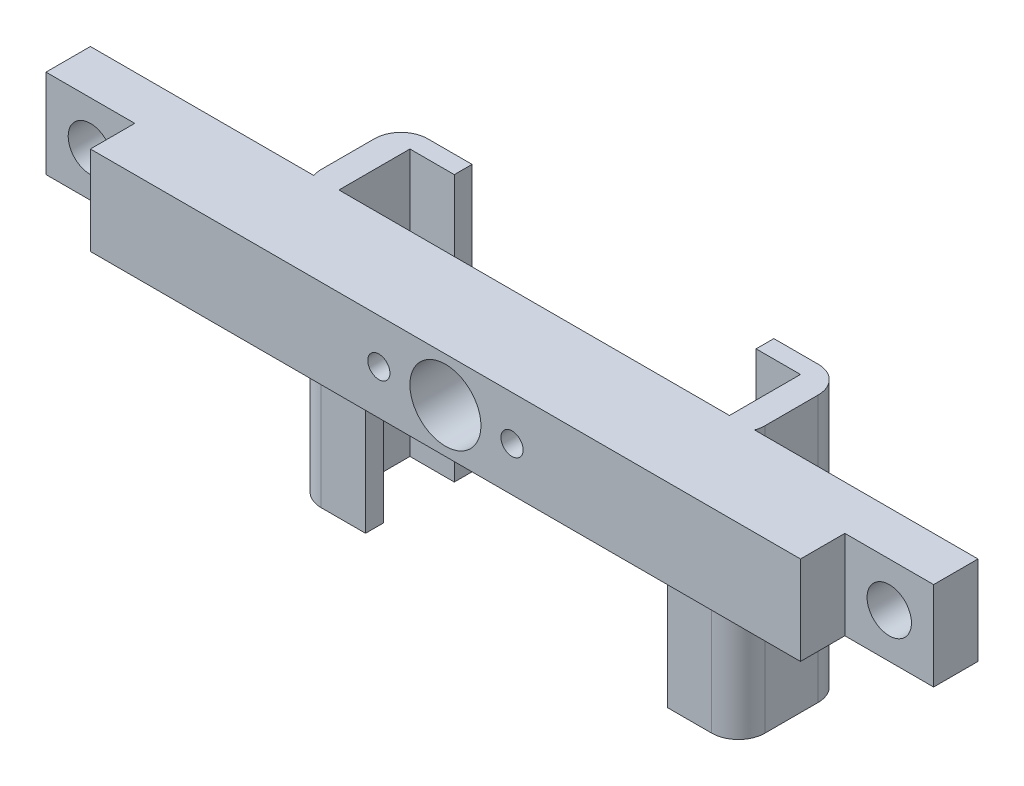
ISO-10303-21;
HEADER;
FILE_DESCRIPTION(('STEP AP214'),'2;1');
FILE_NAME('part.step','',(''),(''),'','','');
FILE_SCHEMA(('AUTOMOTIVE_DESIGN { 1 0 10303 214 1 1 1 1 }'));
ENDSEC;
DATA;
#1=APPLICATION_CONTEXT('core data for automotive mechanical design processes');
#2=APPLICATION_PROTOCOL_DEFINITION('international standard','automotive_design',2000,#1);
#3=PRODUCT_CONTEXT('',#1,'mechanical');
#4=PRODUCT('Part','Part','',(#3));
#5=PRODUCT_RELATED_PRODUCT_CATEGORY('part','',(#4));
#6=PRODUCT_DEFINITION_FORMATION('','',#4);
#7=PRODUCT_DEFINITION_CONTEXT('part definition',#1,'design');
#8=PRODUCT_DEFINITION('design','',#6,#7);
#9=PRODUCT_DEFINITION_SHAPE('','',#8);
#10=(LENGTH_UNIT() NAMED_UNIT(*) SI_UNIT(.MILLI.,.METRE.));
#11=(NAMED_UNIT(*) PLANE_ANGLE_UNIT() SI_UNIT($,.RADIAN.));
#12=(NAMED_UNIT(*) SI_UNIT($,.STERADIAN.) SOLID_ANGLE_UNIT());
#13=UNCERTAINTY_MEASURE_WITH_UNIT(LENGTH_MEASURE(1.E-05),#10,'distance_accuracy_value','');
#14=(GEOMETRIC_REPRESENTATION_CONTEXT(3) GLOBAL_UNCERTAINTY_ASSIGNED_CONTEXT((#13)) GLOBAL_UNIT_ASSIGNED_CONTEXT((#10,
#11,#12)) REPRESENTATION_CONTEXT('',''));
#15=CARTESIAN_POINT('',(0.,0.,0.));
#16=DIRECTION('',(0.,0.,1.));
#17=DIRECTION('',(1.,0.,0.));
#18=AXIS2_PLACEMENT_3D('',#15,#16,#17);
#19=CARTESIAN_POINT('',(-50.,-5.,10.));
#20=DIRECTION('',(0.,1.,0.));
#21=DIRECTION('',(0.,0.,1.));
#22=AXIS2_PLACEMENT_3D('',#19,#20,#21);
#23=PLANE('',#22);
#24=DIRECTION('',(0.,0.,-1.));
#25=VECTOR('',#24,1.);
#26=CARTESIAN_POINT('',(40.,-5.,10.));
#27=LINE('',#26,#25);
#28=CARTESIAN_POINT('',(40.,-5.,10.));
#29=VERTEX_POINT('',#28);
#30=CARTESIAN_POINT('',(40.,-5.,5.));
#31=VERTEX_POINT('',#30);
#32=EDGE_CURVE('E249',#29,#31,#27,.T.);
#33=ORIENTED_EDGE('',*,*,#32,.F.);
#34=DIRECTION('',(1.,0.,0.));
#35=VECTOR('',#34,1.);
#36=CARTESIAN_POINT('',(-50.,-5.,10.));
#37=LINE('',#36,#35);
#38=CARTESIAN_POINT('',(-40.,-5.,10.));
#39=VERTEX_POINT('',#38);
#40=EDGE_CURVE('E262',#39,#29,#37,.T.);
#41=ORIENTED_EDGE('',*,*,#40,.F.);
#42=DIRECTION('',(0.,0.,-1.));
#43=VECTOR('',#42,1.);
#44=CARTESIAN_POINT('',(-40.,-5.,10.));
#45=LINE('',#44,#43);
#46=CARTESIAN_POINT('',(-40.,-5.,5.));
#47=VERTEX_POINT('',#46);
#48=EDGE_CURVE('E554',#39,#47,#45,.T.);
#49=ORIENTED_EDGE('',*,*,#48,.T.);
#50=DIRECTION('',(-1.,0.,0.));
#51=VECTOR('',#50,1.);
#52=CARTESIAN_POINT('',(-50.,-5.,5.));
#53=LINE('',#52,#51);
#54=CARTESIAN_POINT('',(-50.,-5.,5.));
#55=VERTEX_POINT('',#54);
#56=EDGE_CURVE('E545',#47,#55,#53,.T.);
#57=ORIENTED_EDGE('',*,*,#56,.T.);
#58=DIRECTION('',(0.,0.,-1.));
#59=VECTOR('',#58,1.);
#60=CARTESIAN_POINT('',(-50.,-5.,10.));
#61=LINE('',#60,#59);
#62=CARTESIAN_POINT('',(-50.,-5.,0.));
#63=VERTEX_POINT('',#62);
#64=EDGE_CURVE('E261',#55,#63,#61,.T.);
#65=ORIENTED_EDGE('',*,*,#64,.T.);
#66=DIRECTION('',(1.,0.,0.));
#67=VECTOR('',#66,1.);
#68=CARTESIAN_POINT('',(-50.,-5.,0.));
#69=LINE('',#68,#67);
#70=CARTESIAN_POINT('',(-24.8284271247462,-5.,0.));
#71=VERTEX_POINT('',#70);
#72=EDGE_CURVE('E63',#63,#71,#69,.T.);
#73=ORIENTED_EDGE('',*,*,#72,.T.);
#74=CARTESIAN_POINT('',(-22.,-5.,-0.999999999999999));
#75=DIRECTION('',(0.,1.,0.));
#76=DIRECTION('',(0.,0.,1.));
#77=AXIS2_PLACEMENT_3D('',#74,#75,#76);
#78=CIRCLE('',#77,3.);
#79=CARTESIAN_POINT('',(-22.,-5.,2.));
#80=VERTEX_POINT('',#79);
#81=EDGE_CURVE('E335',#71,#80,#78,.T.);
#82=ORIENTED_EDGE('',*,*,#81,.T.);
#83=DIRECTION('',(-1.,0.,0.));
#84=VECTOR('',#83,1.);
#85=CARTESIAN_POINT('',(0.,-5.,2.));
#86=LINE('',#85,#84);
#87=CARTESIAN_POINT('',(-17.,-5.,2.));
#88=VERTEX_POINT('',#87);
#89=EDGE_CURVE('E502',#88,#80,#86,.T.);
#90=ORIENTED_EDGE('',*,*,#89,.F.);
#91=DIRECTION('',(0.,0.,1.));
#92=VECTOR('',#91,1.);
#93=CARTESIAN_POINT('',(-17.,-5.,0.));
#94=LINE('',#93,#92);
#95=CARTESIAN_POINT('',(-17.,-5.,0.));
#96=VERTEX_POINT('',#95);
#97=EDGE_CURVE('E507',#96,#88,#94,.T.);
#98=ORIENTED_EDGE('',*,*,#97,.F.);
#99=CARTESIAN_POINT('',(17.,-5.,0.));
#100=VERTEX_POINT('',#99);
#101=EDGE_CURVE('E376',#96,#100,#69,.T.);
#102=ORIENTED_EDGE('',*,*,#101,.T.);
#103=DIRECTION('',(0.,0.,1.));
#104=VECTOR('',#103,1.);
#105=CARTESIAN_POINT('',(17.,-5.,0.));
#106=LINE('',#105,#104);
#107=CARTESIAN_POINT('',(17.,-5.,2.));
#108=VERTEX_POINT('',#107);
#109=EDGE_CURVE('E425',#100,#108,#106,.T.);
#110=ORIENTED_EDGE('',*,*,#109,.T.);
#111=DIRECTION('',(1.,0.,0.));
#112=VECTOR('',#111,1.);
#113=CARTESIAN_POINT('',(0.,-5.,2.));
#114=LINE('',#113,#112);
#115=CARTESIAN_POINT('',(22.,-5.,2.));
#116=VERTEX_POINT('',#115);
#117=EDGE_CURVE('E343',#108,#116,#114,.T.);
#118=ORIENTED_EDGE('',*,*,#117,.T.);
#119=CARTESIAN_POINT('',(22.,-5.,-1.));
#120=DIRECTION('',(0.,1.,0.));
#121=DIRECTION('',(0.,0.,1.));
#122=AXIS2_PLACEMENT_3D('',#119,#120,#121);
#123=CIRCLE('',#122,3.);
#124=CARTESIAN_POINT('',(24.8284271247462,-5.,0.));
#125=VERTEX_POINT('',#124);
#126=EDGE_CURVE('E49',#116,#125,#123,.T.);
#127=ORIENTED_EDGE('',*,*,#126,.T.);
#128=CARTESIAN_POINT('',(50.,-5.,0.));
#129=VERTEX_POINT('',#128);
#130=EDGE_CURVE('E55',#125,#129,#69,.T.);
#131=ORIENTED_EDGE('',*,*,#130,.T.);
#132=DIRECTION('',(0.,0.,-1.));
#133=VECTOR('',#132,1.);
#134=CARTESIAN_POINT('',(50.,-5.,10.));
#135=LINE('',#134,#133);
#136=CARTESIAN_POINT('',(50.,-5.,5.));
#137=VERTEX_POINT('',#136);
#138=EDGE_CURVE('E256',#137,#129,#135,.T.);
#139=ORIENTED_EDGE('',*,*,#138,.F.);
#140=DIRECTION('',(1.,0.,0.));
#141=VECTOR('',#140,1.);
#142=CARTESIAN_POINT('',(50.,-5.,5.));
#143=LINE('',#142,#141);
#144=EDGE_CURVE('E239',#31,#137,#143,.T.);
#145=ORIENTED_EDGE('',*,*,#144,.F.);
#146=EDGE_LOOP('',(#33,#41,#49,#57,#65,#73,#82,#90,#98,#102,#110,#118,#127,#131,#139,#145));
#147=FACE_BOUND('',#146,.T.);
#148=ADVANCED_FACE('F40',(#147),#23,.F.);
#149=CARTESIAN_POINT('',(50.,5.,10.));
#150=DIRECTION('',(-1.,0.,0.));
#151=DIRECTION('',(0.,0.,1.));
#152=AXIS2_PLACEMENT_3D('',#149,#150,#151);
#153=PLANE('',#152);
#154=DIRECTION('',(0.,1.,0.));
#155=VECTOR('',#154,1.);
#156=CARTESIAN_POINT('',(50.,-5.,5.));
#157=LINE('',#156,#155);
#158=CARTESIAN_POINT('',(50.,5.,5.));
#159=VERTEX_POINT('',#158);
#160=EDGE_CURVE('E243',#137,#159,#157,.T.);
#161=ORIENTED_EDGE('',*,*,#160,.F.);
#162=ORIENTED_EDGE('',*,*,#138,.T.);
#163=DIRECTION('',(0.,1.,0.));
#164=VECTOR('',#163,1.);
#165=CARTESIAN_POINT('',(50.,5.,0.));
#166=LINE('',#165,#164);
#167=CARTESIAN_POINT('',(50.,5.,0.));
#168=VERTEX_POINT('',#167);
#169=EDGE_CURVE('E352',#129,#168,#166,.T.);
#170=ORIENTED_EDGE('',*,*,#169,.T.);
#171=DIRECTION('',(0.,0.,-1.));
#172=VECTOR('',#171,1.);
#173=CARTESIAN_POINT('',(50.,5.,10.));
#174=LINE('',#173,#172);
#175=EDGE_CURVE('E257',#159,#168,#174,.T.);
#176=ORIENTED_EDGE('',*,*,#175,.F.);
#177=EDGE_LOOP('',(#161,#162,#170,#176));
#178=FACE_BOUND('',#177,.T.);
#179=ADVANCED_FACE('F254',(#178),#153,.F.);
#180=CARTESIAN_POINT('',(-50.,5.,10.));
#181=DIRECTION('',(0.,-1.,0.));
#182=DIRECTION('',(0.,0.,-1.));
#183=AXIS2_PLACEMENT_3D('',#180,#181,#182);
#184=PLANE('',#183);
#185=CARTESIAN_POINT('',(-22.,5.,-0.999999999999999));
#186=DIRECTION('',(0.,-1.,0.));
#187=DIRECTION('',(0.,0.,-1.));
#188=AXIS2_PLACEMENT_3D('',#185,#186,#187);
#189=CIRCLE('',#188,3.);
#190=CARTESIAN_POINT('',(-25.,5.,-0.999999999999999));
#191=VERTEX_POINT('',#190);
#192=CARTESIAN_POINT('',(-24.8284271247462,5.,0.));
#193=VERTEX_POINT('',#192);
#194=EDGE_CURVE('E312',#191,#193,#189,.F.);
#195=ORIENTED_EDGE('',*,*,#194,.T.);
#196=DIRECTION('',(-1.,0.,0.));
#197=VECTOR('',#196,1.);
#198=CARTESIAN_POINT('',(-50.,5.,0.));
#199=LINE('',#198,#197);
#200=CARTESIAN_POINT('',(-50.,5.,0.));
#201=VERTEX_POINT('',#200);
#202=EDGE_CURVE('E358',#193,#201,#199,.T.);
#203=ORIENTED_EDGE('',*,*,#202,.T.);
#204=DIRECTION('',(0.,0.,-1.));
#205=VECTOR('',#204,1.);
#206=CARTESIAN_POINT('',(-50.,5.,10.));
#207=LINE('',#206,#205);
#208=CARTESIAN_POINT('',(-50.,5.,5.));
#209=VERTEX_POINT('',#208);
#210=EDGE_CURVE('E267',#209,#201,#207,.T.);
#211=ORIENTED_EDGE('',*,*,#210,.F.);
#212=DIRECTION('',(-1.,0.,0.));
#213=VECTOR('',#212,1.);
#214=CARTESIAN_POINT('',(-50.,5.,5.));
#215=LINE('',#214,#213);
#216=CARTESIAN_POINT('',(-40.,5.,5.));
#217=VERTEX_POINT('',#216);
#218=EDGE_CURVE('E551',#217,#209,#215,.T.);
#219=ORIENTED_EDGE('',*,*,#218,.F.);
#220=DIRECTION('',(0.,0.,-1.));
#221=VECTOR('',#220,1.);
#222=CARTESIAN_POINT('',(-40.,5.,10.));
#223=LINE('',#222,#221);
#224=CARTESIAN_POINT('',(-40.,5.,10.));
#225=VERTEX_POINT('',#224);
#226=EDGE_CURVE('E555',#225,#217,#223,.T.);
#227=ORIENTED_EDGE('',*,*,#226,.F.);
#228=DIRECTION('',(-1.,0.,0.));
#229=VECTOR('',#228,1.);
#230=CARTESIAN_POINT('',(-50.,5.,10.));
#231=LINE('',#230,#229);
#232=CARTESIAN_POINT('',(40.,5.,10.));
#233=VERTEX_POINT('',#232);
#234=EDGE_CURVE('E270',#233,#225,#231,.T.);
#235=ORIENTED_EDGE('',*,*,#234,.F.);
#236=DIRECTION('',(0.,0.,-1.));
#237=VECTOR('',#236,1.);
#238=CARTESIAN_POINT('',(40.,5.,10.));
#239=LINE('',#238,#237);
#240=CARTESIAN_POINT('',(40.,5.,5.));
#241=VERTEX_POINT('',#240);
#242=EDGE_CURVE('E250',#233,#241,#239,.T.);
#243=ORIENTED_EDGE('',*,*,#242,.T.);
#244=DIRECTION('',(1.,0.,0.));
#245=VECTOR('',#244,1.);
#246=CARTESIAN_POINT('',(50.,5.,5.));
#247=LINE('',#246,#245);
#248=EDGE_CURVE('E573',#241,#159,#247,.T.);
#249=ORIENTED_EDGE('',*,*,#248,.T.);
#250=ORIENTED_EDGE('',*,*,#175,.T.);
#251=CARTESIAN_POINT('',(24.8284271247462,5.,0.));
#252=VERTEX_POINT('',#251);
#253=EDGE_CURVE('E351',#168,#252,#199,.T.);
#254=ORIENTED_EDGE('',*,*,#253,.T.);
#255=CARTESIAN_POINT('',(22.,5.,-1.));
#256=DIRECTION('',(0.,-1.,0.));
#257=DIRECTION('',(0.,0.,-1.));
#258=AXIS2_PLACEMENT_3D('',#255,#256,#257);
#259=CIRCLE('',#258,3.);
#260=CARTESIAN_POINT('',(25.,5.,-0.999999999999999));
#261=VERTEX_POINT('',#260);
#262=EDGE_CURVE('E309',#252,#261,#259,.F.);
#263=ORIENTED_EDGE('',*,*,#262,.T.);
#264=DIRECTION('',(0.,0.,1.));
#265=VECTOR('',#264,1.);
#266=CARTESIAN_POINT('',(25.,5.,-10.));
#267=LINE('',#266,#265);
#268=CARTESIAN_POINT('',(25.,5.,-7.));
#269=VERTEX_POINT('',#268);
#270=EDGE_CURVE('E366',#269,#261,#267,.T.);
#271=ORIENTED_EDGE('',*,*,#270,.F.);
#272=CARTESIAN_POINT('',(22.,5.,-7.));
#273=DIRECTION('',(0.,-1.,0.));
#274=DIRECTION('',(0.,0.,-1.));
#275=AXIS2_PLACEMENT_3D('',#272,#273,#274);
#276=CIRCLE('',#275,3.);
#277=CARTESIAN_POINT('',(22.,5.,-10.));
#278=VERTEX_POINT('',#277);
#279=EDGE_CURVE('E292',#269,#278,#276,.F.);
#280=ORIENTED_EDGE('',*,*,#279,.T.);
#281=DIRECTION('',(1.,0.,0.));
#282=VECTOR('',#281,1.);
#283=CARTESIAN_POINT('',(0.,5.,-10.));
#284=LINE('',#283,#282);
#285=CARTESIAN_POINT('',(17.,5.,-10.));
#286=VERTEX_POINT('',#285);
#287=EDGE_CURVE('E392',#286,#278,#284,.T.);
#288=ORIENTED_EDGE('',*,*,#287,.F.);
#289=DIRECTION('',(0.,0.,-1.));
#290=VECTOR('',#289,1.);
#291=CARTESIAN_POINT('',(17.,5.,-10.));
#292=LINE('',#291,#290);
#293=CARTESIAN_POINT('',(17.,5.,-8.));
#294=VERTEX_POINT('',#293);
#295=EDGE_CURVE('E403',#294,#286,#292,.T.);
#296=ORIENTED_EDGE('',*,*,#295,.F.);
#297=DIRECTION('',(1.,0.,0.));
#298=VECTOR('',#297,1.);
#299=CARTESIAN_POINT('',(17.,5.,-8.));
#300=LINE('',#299,#298);
#301=CARTESIAN_POINT('',(22.,5.,-8.));
#302=VERTEX_POINT('',#301);
#303=EDGE_CURVE('E396',#294,#302,#300,.T.);
#304=ORIENTED_EDGE('',*,*,#303,.T.);
#305=DIRECTION('',(0.,0.,1.));
#306=VECTOR('',#305,1.);
#307=CARTESIAN_POINT('',(22.,5.,-10.));
#308=LINE('',#307,#306);
#309=CARTESIAN_POINT('',(22.,5.,0.));
#310=VERTEX_POINT('',#309);
#311=EDGE_CURVE('E360',#302,#310,#308,.T.);
#312=ORIENTED_EDGE('',*,*,#311,.T.);
#313=CARTESIAN_POINT('',(-22.,5.,0.));
#314=VERTEX_POINT('',#313);
#315=EDGE_CURVE('E356',#310,#314,#199,.T.);
#316=ORIENTED_EDGE('',*,*,#315,.T.);
#317=DIRECTION('',(0.,0.,1.));
#318=VECTOR('',#317,1.);
#319=CARTESIAN_POINT('',(-22.,5.,-10.));
#320=LINE('',#319,#318);
#321=CARTESIAN_POINT('',(-22.,5.,-8.));
#322=VERTEX_POINT('',#321);
#323=EDGE_CURVE('E465',#322,#314,#320,.T.);
#324=ORIENTED_EDGE('',*,*,#323,.F.);
#325=DIRECTION('',(-1.,0.,0.));
#326=VECTOR('',#325,1.);
#327=CARTESIAN_POINT('',(-17.,5.,-8.));
#328=LINE('',#327,#326);
#329=CARTESIAN_POINT('',(-17.,5.,-8.));
#330=VERTEX_POINT('',#329);
#331=EDGE_CURVE('E472',#330,#322,#328,.T.);
#332=ORIENTED_EDGE('',*,*,#331,.F.);
#333=DIRECTION('',(0.,0.,-1.));
#334=VECTOR('',#333,1.);
#335=CARTESIAN_POINT('',(-17.,5.,-10.));
#336=LINE('',#335,#334);
#337=CARTESIAN_POINT('',(-17.,5.,-10.));
#338=VERTEX_POINT('',#337);
#339=EDGE_CURVE('E488',#330,#338,#336,.T.);
#340=ORIENTED_EDGE('',*,*,#339,.T.);
#341=DIRECTION('',(-1.,0.,0.));
#342=VECTOR('',#341,1.);
#343=CARTESIAN_POINT('',(0.,5.,-10.));
#344=LINE('',#343,#342);
#345=CARTESIAN_POINT('',(-22.,5.,-10.));
#346=VERTEX_POINT('',#345);
#347=EDGE_CURVE('E468',#338,#346,#344,.T.);
#348=ORIENTED_EDGE('',*,*,#347,.T.);
#349=CARTESIAN_POINT('',(-22.,5.,-7.));
#350=DIRECTION('',(0.,-1.,0.));
#351=DIRECTION('',(0.,0.,-1.));
#352=AXIS2_PLACEMENT_3D('',#349,#350,#351);
#353=CIRCLE('',#352,3.);
#354=CARTESIAN_POINT('',(-25.,5.,-7.));
#355=VERTEX_POINT('',#354);
#356=EDGE_CURVE('E289',#346,#355,#353,.F.);
#357=ORIENTED_EDGE('',*,*,#356,.T.);
#358=DIRECTION('',(0.,0.,1.));
#359=VECTOR('',#358,1.);
#360=CARTESIAN_POINT('',(-25.,5.,-10.));
#361=LINE('',#360,#359);
#362=EDGE_CURVE('E431',#355,#191,#361,.T.);
#363=ORIENTED_EDGE('',*,*,#362,.T.);
#364=EDGE_LOOP('',(#195,#203,#211,#219,#227,#235,#243,#249,#250,#254,#263,#271,#280,#288,#296,
#304,#312,#316,#324,#332,#340,#348,#357,#363));
#365=FACE_BOUND('',#364,.T.);
#366=ADVANCED_FACE('F640',(#365),#184,.F.);
#367=CARTESIAN_POINT('',(0.,0.,10.));
#368=DIRECTION('',(0.,0.,1.));
#369=DIRECTION('',(1.,0.,0.));
#370=AXIS2_PLACEMENT_3D('',#367,#368,#369);
#371=PLANE('',#370);
#372=CARTESIAN_POINT('',(-7.5,0.,10.));
#373=DIRECTION('',(0.,0.,1.));
#374=DIRECTION('',(1.,0.,0.));
#375=AXIS2_PLACEMENT_3D('',#372,#373,#374);
#376=CIRCLE('',#375,1.25);
#377=CARTESIAN_POINT('',(-6.25,0.,10.));
#378=VERTEX_POINT('',#377);
#379=EDGE_CURVE('E603',#378,#378,#376,.F.);
#380=ORIENTED_EDGE('',*,*,#379,.T.);
#381=EDGE_LOOP('',(#380));
#382=FACE_BOUND('',#381,.T.);
#383=CARTESIAN_POINT('',(7.5,0.,10.));
#384=DIRECTION('',(0.,0.,1.));
#385=DIRECTION('',(1.,0.,0.));
#386=AXIS2_PLACEMENT_3D('',#383,#384,#385);
#387=CIRCLE('',#386,1.25);
#388=CARTESIAN_POINT('',(8.75,0.,10.));
#389=VERTEX_POINT('',#388);
#390=EDGE_CURVE('E611',#389,#389,#387,.F.);
#391=ORIENTED_EDGE('',*,*,#390,.T.);
#392=EDGE_LOOP('',(#391));
#393=FACE_BOUND('',#392,.T.);
#394=CARTESIAN_POINT('',(0.,0.,10.));
#395=DIRECTION('',(0.,0.,1.));
#396=DIRECTION('',(1.,0.,0.));
#397=AXIS2_PLACEMENT_3D('',#394,#395,#396);
#398=CIRCLE('',#397,4.);
#399=CARTESIAN_POINT('',(4.,0.,10.));
#400=VERTEX_POINT('',#399);
#401=EDGE_CURVE('E595',#400,#400,#398,.F.);
#402=ORIENTED_EDGE('',*,*,#401,.T.);
#403=EDGE_LOOP('',(#402));
#404=FACE_BOUND('',#403,.T.);
#405=ORIENTED_EDGE('',*,*,#40,.T.);
#406=DIRECTION('',(0.,1.,0.));
#407=VECTOR('',#406,1.);
#408=CARTESIAN_POINT('',(40.,-5.,10.));
#409=LINE('',#408,#407);
#410=EDGE_CURVE('E559',#29,#233,#409,.T.);
#411=ORIENTED_EDGE('',*,*,#410,.T.);
#412=ORIENTED_EDGE('',*,*,#234,.T.);
#413=DIRECTION('',(0.,1.,0.));
#414=VECTOR('',#413,1.);
#415=CARTESIAN_POINT('',(-40.,-5.,10.));
#416=LINE('',#415,#414);
#417=EDGE_CURVE('E541',#39,#225,#416,.T.);
#418=ORIENTED_EDGE('',*,*,#417,.F.);
#419=EDGE_LOOP('',(#405,#411,#412,#418));
#420=FACE_BOUND('',#419,.T.);
#421=ADVANCED_FACE('F626',(#382,#393,#404,#420),#371,.T.);
#422=CARTESIAN_POINT('',(0.,0.,0.));
#423=DIRECTION('',(0.,0.,1.));
#424=DIRECTION('',(1.,0.,0.));
#425=AXIS2_PLACEMENT_3D('',#422,#423,#424);
#426=PLANE('',#425);
#427=CARTESIAN_POINT('',(-7.5,0.,0.));
#428=DIRECTION('',(0.,0.,-1.));
#429=DIRECTION('',(-1.,0.,0.));
#430=AXIS2_PLACEMENT_3D('',#427,#428,#429);
#431=CIRCLE('',#430,1.25);
#432=CARTESIAN_POINT('',(-8.75,0.,0.));
#433=VERTEX_POINT('',#432);
#434=EDGE_CURVE('E607',#433,#433,#431,.T.);
#435=ORIENTED_EDGE('',*,*,#434,.F.);
#436=EDGE_LOOP('',(#435));
#437=FACE_BOUND('',#436,.T.);
#438=CARTESIAN_POINT('',(7.5,0.,0.));
#439=DIRECTION('',(0.,0.,-1.));
#440=DIRECTION('',(-1.,0.,0.));
#441=AXIS2_PLACEMENT_3D('',#438,#439,#440);
#442=CIRCLE('',#441,1.25);
#443=CARTESIAN_POINT('',(6.25,0.,0.));
#444=VERTEX_POINT('',#443);
#445=EDGE_CURVE('E599',#444,#444,#442,.T.);
#446=ORIENTED_EDGE('',*,*,#445,.F.);
#447=EDGE_LOOP('',(#446));
#448=FACE_BOUND('',#447,.T.);
#449=CARTESIAN_POINT('',(0.,0.,0.));
#450=DIRECTION('',(0.,0.,-1.));
#451=DIRECTION('',(-1.,0.,0.));
#452=AXIS2_PLACEMENT_3D('',#449,#450,#451);
#453=CIRCLE('',#452,4.);
#454=CARTESIAN_POINT('',(-4.,0.,0.));
#455=VERTEX_POINT('',#454);
#456=EDGE_CURVE('E591',#455,#455,#453,.T.);
#457=ORIENTED_EDGE('',*,*,#456,.F.);
#458=EDGE_LOOP('',(#457));
#459=FACE_BOUND('',#458,.T.);
#460=DIRECTION('',(0.,-1.,0.));
#461=VECTOR('',#460,1.);
#462=CARTESIAN_POINT('',(-22.,0.,0.));
#463=LINE('',#462,#461);
#464=CARTESIAN_POINT('',(-22.,-25.,0.));
#465=VERTEX_POINT('',#464);
#466=EDGE_CURVE('E469',#314,#465,#463,.T.);
#467=ORIENTED_EDGE('',*,*,#466,.F.);
#468=ORIENTED_EDGE('',*,*,#315,.F.);
#469=DIRECTION('',(0.,-1.,0.));
#470=VECTOR('',#469,1.);
#471=CARTESIAN_POINT('',(22.,0.,0.));
#472=LINE('',#471,#470);
#473=CARTESIAN_POINT('',(22.,-25.,0.));
#474=VERTEX_POINT('',#473);
#475=EDGE_CURVE('E393',#310,#474,#472,.T.);
#476=ORIENTED_EDGE('',*,*,#475,.T.);
#477=DIRECTION('',(1.,0.,0.));
#478=VECTOR('',#477,1.);
#479=CARTESIAN_POINT('',(0.,-25.,0.));
#480=LINE('',#479,#478);
#481=CARTESIAN_POINT('',(17.,-25.,0.));
#482=VERTEX_POINT('',#481);
#483=EDGE_CURVE('E447',#482,#474,#480,.T.);
#484=ORIENTED_EDGE('',*,*,#483,.F.);
#485=DIRECTION('',(0.,1.,0.));
#486=VECTOR('',#485,1.);
#487=CARTESIAN_POINT('',(17.,-25.,0.));
#488=LINE('',#487,#486);
#489=EDGE_CURVE('E420',#482,#100,#488,.T.);
#490=ORIENTED_EDGE('',*,*,#489,.T.);
#491=ORIENTED_EDGE('',*,*,#101,.F.);
#492=DIRECTION('',(0.,1.,0.));
#493=VECTOR('',#492,1.);
#494=CARTESIAN_POINT('',(-17.,-25.,0.));
#495=LINE('',#494,#493);
#496=CARTESIAN_POINT('',(-17.,-25.,0.));
#497=VERTEX_POINT('',#496);
#498=EDGE_CURVE('E484',#497,#96,#495,.T.);
#499=ORIENTED_EDGE('',*,*,#498,.F.);
#500=DIRECTION('',(-1.,0.,0.));
#501=VECTOR('',#500,1.);
#502=CARTESIAN_POINT('',(0.,-25.,0.));
#503=LINE('',#502,#501);
#504=EDGE_CURVE('E518',#497,#465,#503,.T.);
#505=ORIENTED_EDGE('',*,*,#504,.T.);
#506=EDGE_LOOP('',(#467,#468,#476,#484,#490,#491,#499,#505));
#507=FACE_BOUND('',#506,.T.);
#508=ADVANCED_FACE('F622',(#437,#448,#459,#507),#426,.F.);
#509=CARTESIAN_POINT('',(22.,0.,-10.));
#510=DIRECTION('',(-1.,0.,0.));
#511=DIRECTION('',(0.,0.,1.));
#512=AXIS2_PLACEMENT_3D('',#509,#510,#511);
#513=PLANE('',#512);
#514=ORIENTED_EDGE('',*,*,#311,.F.);
#515=DIRECTION('',(0.,1.,0.));
#516=VECTOR('',#515,1.);
#517=CARTESIAN_POINT('',(22.,5.,-8.));
#518=LINE('',#517,#516);
#519=CARTESIAN_POINT('',(22.,-25.,-8.));
#520=VERTEX_POINT('',#519);
#521=EDGE_CURVE('E404',#520,#302,#518,.T.);
#522=ORIENTED_EDGE('',*,*,#521,.F.);
#523=DIRECTION('',(0.,0.,-1.));
#524=VECTOR('',#523,1.);
#525=CARTESIAN_POINT('',(22.,-25.,0.));
#526=LINE('',#525,#524);
#527=EDGE_CURVE('E443',#474,#520,#526,.T.);
#528=ORIENTED_EDGE('',*,*,#527,.F.);
#529=ORIENTED_EDGE('',*,*,#475,.F.);
#530=EDGE_LOOP('',(#514,#522,#528,#529));
#531=FACE_BOUND('',#530,.T.);
#532=ADVANCED_FACE('F625',(#531),#513,.T.);
#533=CARTESIAN_POINT('',(45.,0.,0.));
#534=DIRECTION('',(0.,0.,1.));
#535=DIRECTION('',(1.,0.,0.));
#536=AXIS2_PLACEMENT_3D('',#533,#534,#535);
#537=CIRCLE('',#536,2.5);
#538=CARTESIAN_POINT('',(47.5,0.,0.));
#539=VERTEX_POINT('',#538);
#540=EDGE_CURVE('E576',#539,#539,#537,.F.);
#541=ORIENTED_EDGE('',*,*,#540,.F.);
#542=EDGE_LOOP('',(#541));
#543=FACE_BOUND('',#542,.T.);
#544=ORIENTED_EDGE('',*,*,#130,.F.);
#545=DIRECTION('',(0.,-1.,0.));
#546=VECTOR('',#545,1.);
#547=CARTESIAN_POINT('',(24.8284271247462,-5.,0.));
#548=LINE('',#547,#546);
#549=EDGE_CURVE('E11',#125,#252,#548,.F.);
#550=ORIENTED_EDGE('',*,*,#549,.T.);
#551=ORIENTED_EDGE('',*,*,#253,.F.);
#552=ORIENTED_EDGE('',*,*,#169,.F.);
#553=EDGE_LOOP('',(#544,#550,#551,#552));
#554=FACE_BOUND('',#553,.T.);
#555=ADVANCED_FACE('F350',(#543,#554),#426,.F.);
#556=CARTESIAN_POINT('',(-50.,5.,10.));
#557=DIRECTION('',(1.,0.,0.));
#558=DIRECTION('',(0.,0.,-1.));
#559=AXIS2_PLACEMENT_3D('',#556,#557,#558);
#560=PLANE('',#559);
#561=ORIENTED_EDGE('',*,*,#64,.F.);
#562=DIRECTION('',(0.,1.,0.));
#563=VECTOR('',#562,1.);
#564=CARTESIAN_POINT('',(-50.,-5.,5.));
#565=LINE('',#564,#563);
#566=EDGE_CURVE('E511',#55,#209,#565,.T.);
#567=ORIENTED_EDGE('',*,*,#566,.T.);
#568=ORIENTED_EDGE('',*,*,#210,.T.);
#569=DIRECTION('',(0.,-1.,0.));
#570=VECTOR('',#569,1.);
#571=CARTESIAN_POINT('',(-50.,5.,0.));
#572=LINE('',#571,#570);
#573=EDGE_CURVE('E355',#201,#63,#572,.T.);
#574=ORIENTED_EDGE('',*,*,#573,.T.);
#575=EDGE_LOOP('',(#561,#567,#568,#574));
#576=FACE_BOUND('',#575,.T.);
#577=ADVANCED_FACE('F717',(#576),#560,.F.);
#578=CARTESIAN_POINT('',(-45.,0.,0.));
#579=DIRECTION('',(0.,0.,1.));
#580=DIRECTION('',(1.,0.,0.));
#581=AXIS2_PLACEMENT_3D('',#578,#579,#580);
#582=CIRCLE('',#581,2.5);
#583=CARTESIAN_POINT('',(-42.5,0.,0.));
#584=VERTEX_POINT('',#583);
#585=EDGE_CURVE('E587',#584,#584,#582,.T.);
#586=ORIENTED_EDGE('',*,*,#585,.T.);
#587=EDGE_LOOP('',(#586));
#588=FACE_BOUND('',#587,.T.);
#589=ORIENTED_EDGE('',*,*,#202,.F.);
#590=DIRECTION('',(0.,-1.,0.));
#591=VECTOR('',#590,1.);
#592=CARTESIAN_POINT('',(-24.8284271247462,5.,0.));
#593=LINE('',#592,#591);
#594=EDGE_CURVE('E332',#193,#71,#593,.T.);
#595=ORIENTED_EDGE('',*,*,#594,.T.);
#596=ORIENTED_EDGE('',*,*,#72,.F.);
#597=ORIENTED_EDGE('',*,*,#573,.F.);
#598=EDGE_LOOP('',(#589,#595,#596,#597));
#599=FACE_BOUND('',#598,.T.);
#600=ADVANCED_FACE('F629',(#588,#599),#426,.F.);
#601=CARTESIAN_POINT('',(25.,0.,-10.));
#602=DIRECTION('',(-1.,0.,0.));
#603=DIRECTION('',(0.,0.,1.));
#604=AXIS2_PLACEMENT_3D('',#601,#602,#603);
#605=PLANE('',#604);
#606=ORIENTED_EDGE('',*,*,#270,.T.);
#607=DIRECTION('',(0.,1.,0.));
#608=VECTOR('',#607,1.);
#609=CARTESIAN_POINT('',(25.,-25.,-1.));
#610=LINE('',#609,#608);
#611=CARTESIAN_POINT('',(25.,-25.,-1.));
#612=VERTEX_POINT('',#611);
#613=EDGE_CURVE('E326',#261,#612,#610,.F.);
#614=ORIENTED_EDGE('',*,*,#613,.T.);
#615=DIRECTION('',(0.,0.,1.));
#616=VECTOR('',#615,1.);
#617=CARTESIAN_POINT('',(25.,-25.,0.));
#618=LINE('',#617,#616);
#619=CARTESIAN_POINT('',(25.,-25.,-7.));
#620=VERTEX_POINT('',#619);
#621=EDGE_CURVE('E428',#620,#612,#618,.T.);
#622=ORIENTED_EDGE('',*,*,#621,.F.);
#623=DIRECTION('',(0.,-1.,0.));
#624=VECTOR('',#623,1.);
#625=CARTESIAN_POINT('',(25.,5.,-7.));
#626=LINE('',#625,#624);
#627=EDGE_CURVE('E286',#620,#269,#626,.F.);
#628=ORIENTED_EDGE('',*,*,#627,.T.);
#629=EDGE_LOOP('',(#606,#614,#622,#628));
#630=FACE_BOUND('',#629,.T.);
#631=ADVANCED_FACE('F666',(#630),#605,.F.);
#632=CARTESIAN_POINT('',(0.,0.,-10.));
#633=DIRECTION('',(0.,0.,-1.));
#634=DIRECTION('',(-1.,0.,0.));
#635=AXIS2_PLACEMENT_3D('',#632,#633,#634);
#636=PLANE('',#635);
#637=ORIENTED_EDGE('',*,*,#287,.T.);
#638=DIRECTION('',(0.,-1.,0.));
#639=VECTOR('',#638,1.);
#640=CARTESIAN_POINT('',(22.,-25.,-10.));
#641=LINE('',#640,#639);
#642=CARTESIAN_POINT('',(22.,-25.,-10.));
#643=VERTEX_POINT('',#642);
#644=EDGE_CURVE('E279',#278,#643,#641,.T.);
#645=ORIENTED_EDGE('',*,*,#644,.T.);
#646=DIRECTION('',(1.,0.,0.));
#647=VECTOR('',#646,1.);
#648=CARTESIAN_POINT('',(0.,-25.,-10.));
#649=LINE('',#648,#647);
#650=CARTESIAN_POINT('',(17.,-25.,-10.));
#651=VERTEX_POINT('',#650);
#652=EDGE_CURVE('E424',#651,#643,#649,.T.);
#653=ORIENTED_EDGE('',*,*,#652,.F.);
#654=DIRECTION('',(0.,-1.,0.));
#655=VECTOR('',#654,1.);
#656=CARTESIAN_POINT('',(17.,5.,-10.));
#657=LINE('',#656,#655);
#658=EDGE_CURVE('E408',#286,#651,#657,.T.);
#659=ORIENTED_EDGE('',*,*,#658,.F.);
#660=EDGE_LOOP('',(#637,#645,#653,#659));
#661=FACE_BOUND('',#660,.T.);
#662=ADVANCED_FACE('F660',(#661),#636,.T.);
#663=CARTESIAN_POINT('',(17.,5.,-8.));
#664=DIRECTION('',(0.,0.,-1.));
#665=DIRECTION('',(0.,1.,0.));
#666=AXIS2_PLACEMENT_3D('',#663,#664,#665);
#667=PLANE('',#666);
#668=ORIENTED_EDGE('',*,*,#521,.T.);
#669=ORIENTED_EDGE('',*,*,#303,.F.);
#670=DIRECTION('',(0.,1.,0.));
#671=VECTOR('',#670,1.);
#672=CARTESIAN_POINT('',(17.,5.,-8.));
#673=LINE('',#672,#671);
#674=CARTESIAN_POINT('',(17.,-25.,-8.));
#675=VERTEX_POINT('',#674);
#676=EDGE_CURVE('E413',#675,#294,#673,.T.);
#677=ORIENTED_EDGE('',*,*,#676,.F.);
#678=DIRECTION('',(-1.,0.,0.));
#679=VECTOR('',#678,1.);
#680=CARTESIAN_POINT('',(0.,-25.,-8.));
#681=LINE('',#680,#679);
#682=EDGE_CURVE('E439',#520,#675,#681,.T.);
#683=ORIENTED_EDGE('',*,*,#682,.F.);
#684=EDGE_LOOP('',(#668,#669,#677,#683));
#685=FACE_BOUND('',#684,.T.);
#686=ADVANCED_FACE('F651',(#685),#667,.F.);
#687=CARTESIAN_POINT('',(17.,0.,0.));
#688=DIRECTION('',(-1.,0.,0.));
#689=DIRECTION('',(0.,0.,1.));
#690=AXIS2_PLACEMENT_3D('',#687,#688,#689);
#691=PLANE('',#690);
#692=ORIENTED_EDGE('',*,*,#658,.T.);
#693=DIRECTION('',(0.,0.,-1.));
#694=VECTOR('',#693,1.);
#695=CARTESIAN_POINT('',(17.,-25.,0.));
#696=LINE('',#695,#694);
#697=EDGE_CURVE('E435',#675,#651,#696,.T.);
#698=ORIENTED_EDGE('',*,*,#697,.F.);
#699=ORIENTED_EDGE('',*,*,#676,.T.);
#700=ORIENTED_EDGE('',*,*,#295,.T.);
#701=EDGE_LOOP('',(#692,#698,#699,#700));
#702=FACE_BOUND('',#701,.T.);
#703=ADVANCED_FACE('F657',(#702),#691,.T.);
#704=CARTESIAN_POINT('',(0.,-25.,2.));
#705=DIRECTION('',(0.,0.,1.));
#706=DIRECTION('',(1.,0.,0.));
#707=AXIS2_PLACEMENT_3D('',#704,#705,#706);
#708=PLANE('',#707);
#709=DIRECTION('',(1.,0.,0.));
#710=VECTOR('',#709,1.);
#711=CARTESIAN_POINT('',(0.,-25.,2.));
#712=LINE('',#711,#710);
#713=CARTESIAN_POINT('',(17.,-25.,2.));
#714=VERTEX_POINT('',#713);
#715=CARTESIAN_POINT('',(22.,-25.,2.));
#716=VERTEX_POINT('',#715);
#717=EDGE_CURVE('E455',#714,#716,#712,.T.);
#718=ORIENTED_EDGE('',*,*,#717,.T.);
#719=DIRECTION('',(0.,1.,0.));
#720=VECTOR('',#719,1.);
#721=CARTESIAN_POINT('',(22.,-5.,2.));
#722=LINE('',#721,#720);
#723=EDGE_CURVE('E322',#716,#116,#722,.T.);
#724=ORIENTED_EDGE('',*,*,#723,.T.);
#725=ORIENTED_EDGE('',*,*,#117,.F.);
#726=DIRECTION('',(0.,1.,0.));
#727=VECTOR('',#726,1.);
#728=CARTESIAN_POINT('',(17.,-25.,2.));
#729=LINE('',#728,#727);
#730=EDGE_CURVE('E409',#714,#108,#729,.T.);
#731=ORIENTED_EDGE('',*,*,#730,.F.);
#732=EDGE_LOOP('',(#718,#724,#725,#731));
#733=FACE_BOUND('',#732,.T.);
#734=ADVANCED_FACE('F673',(#733),#708,.T.);
#735=CARTESIAN_POINT('',(17.,-25.,0.));
#736=DIRECTION('',(-1.,0.,0.));
#737=DIRECTION('',(0.,0.,1.));
#738=AXIS2_PLACEMENT_3D('',#735,#736,#737);
#739=PLANE('',#738);
#740=ORIENTED_EDGE('',*,*,#109,.F.);
#741=ORIENTED_EDGE('',*,*,#489,.F.);
#742=DIRECTION('',(0.,0.,1.));
#743=VECTOR('',#742,1.);
#744=CARTESIAN_POINT('',(17.,-25.,0.));
#745=LINE('',#744,#743);
#746=EDGE_CURVE('E451',#482,#714,#745,.T.);
#747=ORIENTED_EDGE('',*,*,#746,.T.);
#748=ORIENTED_EDGE('',*,*,#730,.T.);
#749=EDGE_LOOP('',(#740,#741,#747,#748));
#750=FACE_BOUND('',#749,.T.);
#751=ADVANCED_FACE('F676',(#750),#739,.T.);
#752=CARTESIAN_POINT('',(0.,-25.,0.));
#753=DIRECTION('',(0.,-1.,0.));
#754=DIRECTION('',(0.,0.,-1.));
#755=AXIS2_PLACEMENT_3D('',#752,#753,#754);
#756=PLANE('',#755);
#757=ORIENTED_EDGE('',*,*,#621,.T.);
#758=CARTESIAN_POINT('',(22.,-25.,-1.));
#759=DIRECTION('',(0.,-1.,0.));
#760=DIRECTION('',(0.,0.,-1.));
#761=AXIS2_PLACEMENT_3D('',#758,#759,#760);
#762=CIRCLE('',#761,3.);
#763=EDGE_CURVE('E329',#612,#716,#762,.T.);
#764=ORIENTED_EDGE('',*,*,#763,.T.);
#765=ORIENTED_EDGE('',*,*,#717,.F.);
#766=ORIENTED_EDGE('',*,*,#746,.F.);
#767=ORIENTED_EDGE('',*,*,#483,.T.);
#768=ORIENTED_EDGE('',*,*,#527,.T.);
#769=ORIENTED_EDGE('',*,*,#682,.T.);
#770=ORIENTED_EDGE('',*,*,#697,.T.);
#771=ORIENTED_EDGE('',*,*,#652,.T.);
#772=CARTESIAN_POINT('',(22.,-25.,-7.));
#773=DIRECTION('',(0.,-1.,0.));
#774=DIRECTION('',(0.,0.,-1.));
#775=AXIS2_PLACEMENT_3D('',#772,#773,#774);
#776=CIRCLE('',#775,3.);
#777=EDGE_CURVE('E283',#643,#620,#776,.T.);
#778=ORIENTED_EDGE('',*,*,#777,.T.);
#779=EDGE_LOOP('',(#757,#764,#765,#766,#767,#768,#769,#770,#771,#778));
#780=FACE_BOUND('',#779,.T.);
#781=ADVANCED_FACE('F654',(#780),#756,.T.);
#782=CARTESIAN_POINT('',(-22.,0.,-10.));
#783=DIRECTION('',(-1.,0.,0.));
#784=DIRECTION('',(0.,0.,1.));
#785=AXIS2_PLACEMENT_3D('',#782,#783,#784);
#786=PLANE('',#785);
#787=ORIENTED_EDGE('',*,*,#466,.T.);
#788=DIRECTION('',(0.,0.,-1.));
#789=VECTOR('',#788,1.);
#790=CARTESIAN_POINT('',(-22.,-25.,0.));
#791=LINE('',#790,#789);
#792=CARTESIAN_POINT('',(-22.,-25.,-8.));
#793=VERTEX_POINT('',#792);
#794=EDGE_CURVE('E522',#465,#793,#791,.T.);
#795=ORIENTED_EDGE('',*,*,#794,.T.);
#796=DIRECTION('',(0.,1.,0.));
#797=VECTOR('',#796,1.);
#798=CARTESIAN_POINT('',(-22.,5.,-8.));
#799=LINE('',#798,#797);
#800=EDGE_CURVE('E479',#793,#322,#799,.T.);
#801=ORIENTED_EDGE('',*,*,#800,.T.);
#802=ORIENTED_EDGE('',*,*,#323,.T.);
#803=EDGE_LOOP('',(#787,#795,#801,#802));
#804=FACE_BOUND('',#803,.T.);
#805=ADVANCED_FACE('F688',(#804),#786,.F.);
#806=CARTESIAN_POINT('',(-25.,0.,-10.));
#807=DIRECTION('',(-1.,0.,0.));
#808=DIRECTION('',(0.,0.,1.));
#809=AXIS2_PLACEMENT_3D('',#806,#807,#808);
#810=PLANE('',#809);
#811=DIRECTION('',(0.,0.,1.));
#812=VECTOR('',#811,1.);
#813=CARTESIAN_POINT('',(-25.,-25.,0.));
#814=LINE('',#813,#812);
#815=CARTESIAN_POINT('',(-25.,-25.,-7.));
#816=VERTEX_POINT('',#815);
#817=CARTESIAN_POINT('',(-25.,-25.,-0.999999999999999));
#818=VERTEX_POINT('',#817);
#819=EDGE_CURVE('E506',#816,#818,#814,.T.);
#820=ORIENTED_EDGE('',*,*,#819,.T.);
#821=DIRECTION('',(0.,1.,0.));
#822=VECTOR('',#821,1.);
#823=CARTESIAN_POINT('',(-25.,-5.,-0.999999999999999));
#824=LINE('',#823,#822);
#825=EDGE_CURVE('E305',#818,#191,#824,.T.);
#826=ORIENTED_EDGE('',*,*,#825,.T.);
#827=ORIENTED_EDGE('',*,*,#362,.F.);
#828=DIRECTION('',(0.,-1.,0.));
#829=VECTOR('',#828,1.);
#830=CARTESIAN_POINT('',(-25.,0.,-7.));
#831=LINE('',#830,#829);
#832=EDGE_CURVE('E295',#355,#816,#831,.T.);
#833=ORIENTED_EDGE('',*,*,#832,.T.);
#834=EDGE_LOOP('',(#820,#826,#827,#833));
#835=FACE_BOUND('',#834,.T.);
#836=ADVANCED_FACE('F706',(#835),#810,.T.);
#837=CARTESIAN_POINT('',(0.,0.,-10.));
#838=DIRECTION('',(0.,0.,-1.));
#839=DIRECTION('',(1.,0.,0.));
#840=AXIS2_PLACEMENT_3D('',#837,#838,#839);
#841=PLANE('',#840);
#842=DIRECTION('',(-1.,0.,0.));
#843=VECTOR('',#842,1.);
#844=CARTESIAN_POINT('',(0.,-25.,-10.));
#845=LINE('',#844,#843);
#846=CARTESIAN_POINT('',(-17.,-25.,-10.));
#847=VERTEX_POINT('',#846);
#848=CARTESIAN_POINT('',(-22.,-25.,-10.));
#849=VERTEX_POINT('',#848);
#850=EDGE_CURVE('E534',#847,#849,#845,.T.);
#851=ORIENTED_EDGE('',*,*,#850,.T.);
#852=DIRECTION('',(0.,-1.,0.));
#853=VECTOR('',#852,1.);
#854=CARTESIAN_POINT('',(-22.,0.,-10.));
#855=LINE('',#854,#853);
#856=EDGE_CURVE('E302',#849,#346,#855,.F.);
#857=ORIENTED_EDGE('',*,*,#856,.T.);
#858=ORIENTED_EDGE('',*,*,#347,.F.);
#859=DIRECTION('',(0.,-1.,0.));
#860=VECTOR('',#859,1.);
#861=CARTESIAN_POINT('',(-17.,5.,-10.));
#862=LINE('',#861,#860);
#863=EDGE_CURVE('E483',#338,#847,#862,.T.);
#864=ORIENTED_EDGE('',*,*,#863,.T.);
#865=EDGE_LOOP('',(#851,#857,#858,#864));
#866=FACE_BOUND('',#865,.T.);
#867=ADVANCED_FACE('F697',(#866),#841,.T.);
#868=CARTESIAN_POINT('',(-17.,5.,-8.));
#869=DIRECTION('',(0.,0.,1.));
#870=DIRECTION('',(0.,-1.,0.));
#871=AXIS2_PLACEMENT_3D('',#868,#869,#870);
#872=PLANE('',#871);
#873=ORIENTED_EDGE('',*,*,#800,.F.);
#874=DIRECTION('',(1.,0.,0.));
#875=VECTOR('',#874,1.);
#876=CARTESIAN_POINT('',(0.,-25.,-8.));
#877=LINE('',#876,#875);
#878=CARTESIAN_POINT('',(-17.,-25.,-8.));
#879=VERTEX_POINT('',#878);
#880=EDGE_CURVE('E526',#793,#879,#877,.T.);
#881=ORIENTED_EDGE('',*,*,#880,.T.);
#882=DIRECTION('',(0.,1.,0.));
#883=VECTOR('',#882,1.);
#884=CARTESIAN_POINT('',(-17.,5.,-8.));
#885=LINE('',#884,#883);
#886=EDGE_CURVE('E478',#879,#330,#885,.T.);
#887=ORIENTED_EDGE('',*,*,#886,.T.);
#888=ORIENTED_EDGE('',*,*,#331,.T.);
#889=EDGE_LOOP('',(#873,#881,#887,#888));
#890=FACE_BOUND('',#889,.T.);
#891=ADVANCED_FACE('F690',(#890),#872,.T.);
#892=CARTESIAN_POINT('',(-17.,0.,0.));
#893=DIRECTION('',(1.,0.,0.));
#894=DIRECTION('',(0.,0.,1.));
#895=AXIS2_PLACEMENT_3D('',#892,#893,#894);
#896=PLANE('',#895);
#897=ORIENTED_EDGE('',*,*,#863,.F.);
#898=ORIENTED_EDGE('',*,*,#339,.F.);
#899=ORIENTED_EDGE('',*,*,#886,.F.);
#900=DIRECTION('',(0.,0.,-1.));
#901=VECTOR('',#900,1.);
#902=CARTESIAN_POINT('',(-17.,-25.,0.));
#903=LINE('',#902,#901);
#904=EDGE_CURVE('E530',#879,#847,#903,.T.);
#905=ORIENTED_EDGE('',*,*,#904,.T.);
#906=EDGE_LOOP('',(#897,#898,#899,#905));
#907=FACE_BOUND('',#906,.T.);
#908=ADVANCED_FACE('F694',(#907),#896,.T.);
#909=CARTESIAN_POINT('',(-17.,-25.,0.));
#910=DIRECTION('',(-1.,0.,0.));
#911=DIRECTION('',(0.,0.,1.));
#912=AXIS2_PLACEMENT_3D('',#909,#910,#911);
#913=PLANE('',#912);
#914=ORIENTED_EDGE('',*,*,#97,.T.);
#915=DIRECTION('',(0.,1.,0.));
#916=VECTOR('',#915,1.);
#917=CARTESIAN_POINT('',(-17.,-25.,2.));
#918=LINE('',#917,#916);
#919=CARTESIAN_POINT('',(-17.,-25.,2.));
#920=VERTEX_POINT('',#919);
#921=EDGE_CURVE('E497',#920,#88,#918,.T.);
#922=ORIENTED_EDGE('',*,*,#921,.F.);
#923=DIRECTION('',(0.,0.,1.));
#924=VECTOR('',#923,1.);
#925=CARTESIAN_POINT('',(-17.,-25.,0.));
#926=LINE('',#925,#924);
#927=EDGE_CURVE('E515',#497,#920,#926,.T.);
#928=ORIENTED_EDGE('',*,*,#927,.F.);
#929=ORIENTED_EDGE('',*,*,#498,.T.);
#930=EDGE_LOOP('',(#914,#922,#928,#929));
#931=FACE_BOUND('',#930,.T.);
#932=ADVANCED_FACE('F681',(#931),#913,.F.);
#933=CARTESIAN_POINT('',(0.,-25.,2.));
#934=DIRECTION('',(0.,0.,-1.));
#935=DIRECTION('',(-1.,0.,0.));
#936=AXIS2_PLACEMENT_3D('',#933,#934,#935);
#937=PLANE('',#936);
#938=ORIENTED_EDGE('',*,*,#89,.T.);
#939=DIRECTION('',(0.,1.,0.));
#940=VECTOR('',#939,1.);
#941=CARTESIAN_POINT('',(-22.,-25.,2.));
#942=LINE('',#941,#940);
#943=CARTESIAN_POINT('',(-22.,-25.,2.));
#944=VERTEX_POINT('',#943);
#945=EDGE_CURVE('E316',#80,#944,#942,.F.);
#946=ORIENTED_EDGE('',*,*,#945,.T.);
#947=DIRECTION('',(-1.,0.,0.));
#948=VECTOR('',#947,1.);
#949=CARTESIAN_POINT('',(0.,-25.,2.));
#950=LINE('',#949,#948);
#951=EDGE_CURVE('E501',#920,#944,#950,.T.);
#952=ORIENTED_EDGE('',*,*,#951,.F.);
#953=ORIENTED_EDGE('',*,*,#921,.T.);
#954=EDGE_LOOP('',(#938,#946,#952,#953));
#955=FACE_BOUND('',#954,.T.);
#956=ADVANCED_FACE('F866',(#955),#937,.F.);
#957=CARTESIAN_POINT('',(0.,-25.,0.));
#958=DIRECTION('',(0.,-1.,0.));
#959=DIRECTION('',(0.,0.,-1.));
#960=AXIS2_PLACEMENT_3D('',#957,#958,#959);
#961=PLANE('',#960);
#962=ORIENTED_EDGE('',*,*,#951,.T.);
#963=CARTESIAN_POINT('',(-22.,-25.,-0.999999999999999));
#964=DIRECTION('',(0.,-1.,0.));
#965=DIRECTION('',(0.,0.,-1.));
#966=AXIS2_PLACEMENT_3D('',#963,#964,#965);
#967=CIRCLE('',#966,3.);
#968=EDGE_CURVE('E319',#944,#818,#967,.T.);
#969=ORIENTED_EDGE('',*,*,#968,.T.);
#970=ORIENTED_EDGE('',*,*,#819,.F.);
#971=CARTESIAN_POINT('',(-22.,-25.,-7.));
#972=DIRECTION('',(0.,-1.,0.));
#973=DIRECTION('',(0.,0.,-1.));
#974=AXIS2_PLACEMENT_3D('',#971,#972,#973);
#975=CIRCLE('',#974,3.);
#976=EDGE_CURVE('E299',#816,#849,#975,.T.);
#977=ORIENTED_EDGE('',*,*,#976,.T.);
#978=ORIENTED_EDGE('',*,*,#850,.F.);
#979=ORIENTED_EDGE('',*,*,#904,.F.);
#980=ORIENTED_EDGE('',*,*,#880,.F.);
#981=ORIENTED_EDGE('',*,*,#794,.F.);
#982=ORIENTED_EDGE('',*,*,#504,.F.);
#983=ORIENTED_EDGE('',*,*,#927,.T.);
#984=EDGE_LOOP('',(#962,#969,#970,#977,#978,#979,#980,#981,#982,#983));
#985=FACE_BOUND('',#984,.T.);
#986=ADVANCED_FACE('F685',(#985),#961,.T.);
#987=CARTESIAN_POINT('',(-50.,-5.,5.));
#988=DIRECTION('',(0.,0.,-1.));
#989=DIRECTION('',(-1.,0.,0.));
#990=AXIS2_PLACEMENT_3D('',#987,#988,#989);
#991=PLANE('',#990);
#992=CARTESIAN_POINT('',(-45.,0.,5.));
#993=DIRECTION('',(0.,0.,-1.));
#994=DIRECTION('',(-1.,0.,0.));
#995=AXIS2_PLACEMENT_3D('',#992,#993,#994);
#996=CIRCLE('',#995,2.5);
#997=CARTESIAN_POINT('',(-47.5,0.,5.));
#998=VERTEX_POINT('',#997);
#999=EDGE_CURVE('E586',#998,#998,#996,.T.);
#1000=ORIENTED_EDGE('',*,*,#999,.T.);
#1001=EDGE_LOOP('',(#1000));
#1002=FACE_BOUND('',#1001,.T.);
#1003=ORIENTED_EDGE('',*,*,#218,.T.);
#1004=ORIENTED_EDGE('',*,*,#566,.F.);
#1005=ORIENTED_EDGE('',*,*,#56,.F.);
#1006=DIRECTION('',(0.,1.,0.));
#1007=VECTOR('',#1006,1.);
#1008=CARTESIAN_POINT('',(-40.,-5.,5.));
#1009=LINE('',#1008,#1007);
#1010=EDGE_CURVE('E544',#47,#217,#1009,.T.);
#1011=ORIENTED_EDGE('',*,*,#1010,.T.);
#1012=EDGE_LOOP('',(#1003,#1004,#1005,#1011));
#1013=FACE_BOUND('',#1012,.T.);
#1014=ADVANCED_FACE('F848',(#1002,#1013),#991,.F.);
#1015=CARTESIAN_POINT('',(-40.,-5.,10.));
#1016=DIRECTION('',(1.,0.,0.));
#1017=DIRECTION('',(0.,0.,-1.));
#1018=AXIS2_PLACEMENT_3D('',#1015,#1016,#1017);
#1019=PLANE('',#1018);
#1020=ORIENTED_EDGE('',*,*,#226,.T.);
#1021=ORIENTED_EDGE('',*,*,#1010,.F.);
#1022=ORIENTED_EDGE('',*,*,#48,.F.);
#1023=ORIENTED_EDGE('',*,*,#417,.T.);
#1024=EDGE_LOOP('',(#1020,#1021,#1022,#1023));
#1025=FACE_BOUND('',#1024,.T.);
#1026=ADVANCED_FACE('F837',(#1025),#1019,.F.);
#1027=CARTESIAN_POINT('',(40.,-5.,10.));
#1028=DIRECTION('',(1.,0.,0.));
#1029=DIRECTION('',(0.,0.,-1.));
#1030=AXIS2_PLACEMENT_3D('',#1027,#1028,#1029);
#1031=PLANE('',#1030);
#1032=ORIENTED_EDGE('',*,*,#242,.F.);
#1033=ORIENTED_EDGE('',*,*,#410,.F.);
#1034=ORIENTED_EDGE('',*,*,#32,.T.);
#1035=DIRECTION('',(0.,1.,0.));
#1036=VECTOR('',#1035,1.);
#1037=CARTESIAN_POINT('',(40.,-5.,5.));
#1038=LINE('',#1037,#1036);
#1039=EDGE_CURVE('E245',#31,#241,#1038,.T.);
#1040=ORIENTED_EDGE('',*,*,#1039,.T.);
#1041=EDGE_LOOP('',(#1032,#1033,#1034,#1040));
#1042=FACE_BOUND('',#1041,.T.);
#1043=ADVANCED_FACE('F827',(#1042),#1031,.T.);
#1044=CARTESIAN_POINT('',(50.,-5.,5.));
#1045=DIRECTION('',(0.,0.,1.));
#1046=DIRECTION('',(1.,0.,0.));
#1047=AXIS2_PLACEMENT_3D('',#1044,#1045,#1046);
#1048=PLANE('',#1047);
#1049=CARTESIAN_POINT('',(45.,0.,5.));
#1050=DIRECTION('',(0.,0.,1.));
#1051=DIRECTION('',(1.,0.,0.));
#1052=AXIS2_PLACEMENT_3D('',#1049,#1050,#1051);
#1053=CIRCLE('',#1052,2.5);
#1054=CARTESIAN_POINT('',(47.5,0.,5.));
#1055=VERTEX_POINT('',#1054);
#1056=EDGE_CURVE('E582',#1055,#1055,#1053,.T.);
#1057=ORIENTED_EDGE('',*,*,#1056,.F.);
#1058=EDGE_LOOP('',(#1057));
#1059=FACE_BOUND('',#1058,.T.);
#1060=ORIENTED_EDGE('',*,*,#248,.F.);
#1061=ORIENTED_EDGE('',*,*,#1039,.F.);
#1062=ORIENTED_EDGE('',*,*,#144,.T.);
#1063=ORIENTED_EDGE('',*,*,#160,.T.);
#1064=EDGE_LOOP('',(#1060,#1061,#1062,#1063));
#1065=FACE_BOUND('',#1064,.T.);
#1066=ADVANCED_FACE('F242',(#1059,#1065),#1048,.T.);
#1067=CARTESIAN_POINT('',(45.,0.,-10.001));
#1068=DIRECTION('',(0.,0.,1.));
#1069=DIRECTION('',(1.,0.,0.));
#1070=AXIS2_PLACEMENT_3D('',#1067,#1068,#1069);
#1071=CYLINDRICAL_SURFACE('',#1070,2.5);
#1072=ORIENTED_EDGE('',*,*,#1056,.T.);
#1073=EDGE_LOOP('',(#1072));
#1074=FACE_BOUND('',#1073,.T.);
#1075=ORIENTED_EDGE('',*,*,#540,.T.);
#1076=EDGE_LOOP('',(#1075));
#1077=FACE_BOUND('',#1076,.T.);
#1078=ADVANCED_FACE('F806',(#1074,#1077),#1071,.F.);
#1079=CARTESIAN_POINT('',(-45.,0.,-10.001));
#1080=DIRECTION('',(0.,0.,1.));
#1081=DIRECTION('',(1.,0.,0.));
#1082=AXIS2_PLACEMENT_3D('',#1079,#1080,#1081);
#1083=CYLINDRICAL_SURFACE('',#1082,2.5);
#1084=ORIENTED_EDGE('',*,*,#999,.F.);
#1085=EDGE_LOOP('',(#1084));
#1086=FACE_BOUND('',#1085,.T.);
#1087=ORIENTED_EDGE('',*,*,#585,.F.);
#1088=EDGE_LOOP('',(#1087));
#1089=FACE_BOUND('',#1088,.T.);
#1090=ADVANCED_FACE('F795',(#1086,#1089),#1083,.F.);
#1091=CARTESIAN_POINT('',(0.,0.,10.001));
#1092=DIRECTION('',(0.,0.,-1.));
#1093=DIRECTION('',(-1.,0.,0.));
#1094=AXIS2_PLACEMENT_3D('',#1091,#1092,#1093);
#1095=CYLINDRICAL_SURFACE('',#1094,4.);
#1096=ORIENTED_EDGE('',*,*,#401,.F.);
#1097=EDGE_LOOP('',(#1096));
#1098=FACE_BOUND('',#1097,.T.);
#1099=ORIENTED_EDGE('',*,*,#456,.T.);
#1100=EDGE_LOOP('',(#1099));
#1101=FACE_BOUND('',#1100,.T.);
#1102=ADVANCED_FACE('F785',(#1098,#1101),#1095,.F.);
#1103=CARTESIAN_POINT('',(7.5,0.,10.001));
#1104=DIRECTION('',(0.,0.,-1.));
#1105=DIRECTION('',(-1.,0.,0.));
#1106=AXIS2_PLACEMENT_3D('',#1103,#1104,#1105);
#1107=CYLINDRICAL_SURFACE('',#1106,1.25);
#1108=ORIENTED_EDGE('',*,*,#390,.F.);
#1109=EDGE_LOOP('',(#1108));
#1110=FACE_BOUND('',#1109,.T.);
#1111=ORIENTED_EDGE('',*,*,#445,.T.);
#1112=EDGE_LOOP('',(#1111));
#1113=FACE_BOUND('',#1112,.T.);
#1114=ADVANCED_FACE('F620',(#1110,#1113),#1107,.F.);
#1115=CARTESIAN_POINT('',(-7.5,0.,10.001));
#1116=DIRECTION('',(0.,0.,-1.));
#1117=DIRECTION('',(-1.,0.,0.));
#1118=AXIS2_PLACEMENT_3D('',#1115,#1116,#1117);
#1119=CYLINDRICAL_SURFACE('',#1118,1.25);
#1120=ORIENTED_EDGE('',*,*,#379,.F.);
#1121=EDGE_LOOP('',(#1120));
#1122=FACE_BOUND('',#1121,.T.);
#1123=ORIENTED_EDGE('',*,*,#434,.T.);
#1124=EDGE_LOOP('',(#1123));
#1125=FACE_BOUND('',#1124,.T.);
#1126=ADVANCED_FACE('F739',(#1122,#1125),#1119,.F.);
#1127=CARTESIAN_POINT('',(22.,0.,-7.));
#1128=DIRECTION('',(0.,1.,0.));
#1129=DIRECTION('',(0.,0.,1.));
#1130=AXIS2_PLACEMENT_3D('',#1127,#1128,#1129);
#1131=CYLINDRICAL_SURFACE('',#1130,3.);
#1132=ORIENTED_EDGE('',*,*,#279,.F.);
#1133=ORIENTED_EDGE('',*,*,#627,.F.);
#1134=ORIENTED_EDGE('',*,*,#777,.F.);
#1135=ORIENTED_EDGE('',*,*,#644,.F.);
#1136=EDGE_LOOP('',(#1132,#1133,#1134,#1135));
#1137=FACE_BOUND('',#1136,.T.);
#1138=ADVANCED_FACE('F669',(#1137),#1131,.T.);
#1139=CARTESIAN_POINT('',(-22.,0.,-7.));
#1140=DIRECTION('',(0.,-1.,0.));
#1141=DIRECTION('',(0.,0.,-1.));
#1142=AXIS2_PLACEMENT_3D('',#1139,#1140,#1141);
#1143=CYLINDRICAL_SURFACE('',#1142,3.);
#1144=ORIENTED_EDGE('',*,*,#356,.F.);
#1145=ORIENTED_EDGE('',*,*,#856,.F.);
#1146=ORIENTED_EDGE('',*,*,#976,.F.);
#1147=ORIENTED_EDGE('',*,*,#832,.F.);
#1148=EDGE_LOOP('',(#1144,#1145,#1146,#1147));
#1149=FACE_BOUND('',#1148,.T.);
#1150=ADVANCED_FACE('F703',(#1149),#1143,.T.);
#1151=CARTESIAN_POINT('',(-22.,0.,-0.999999999999999));
#1152=DIRECTION('',(0.,-1.,0.));
#1153=DIRECTION('',(0.,0.,-1.));
#1154=AXIS2_PLACEMENT_3D('',#1151,#1152,#1153);
#1155=CYLINDRICAL_SURFACE('',#1154,3.);
#1156=ORIENTED_EDGE('',*,*,#968,.F.);
#1157=ORIENTED_EDGE('',*,*,#945,.F.);
#1158=ORIENTED_EDGE('',*,*,#81,.F.);
#1159=ORIENTED_EDGE('',*,*,#594,.F.);
#1160=ORIENTED_EDGE('',*,*,#194,.F.);
#1161=ORIENTED_EDGE('',*,*,#825,.F.);
#1162=EDGE_LOOP('',(#1156,#1157,#1158,#1159,#1160,#1161));
#1163=FACE_BOUND('',#1162,.T.);
#1164=ADVANCED_FACE('F713',(#1163),#1155,.T.);
#1165=CARTESIAN_POINT('',(22.,-25.,-1.));
#1166=DIRECTION('',(0.,-1.,0.));
#1167=DIRECTION('',(0.,0.,-1.));
#1168=AXIS2_PLACEMENT_3D('',#1165,#1166,#1167);
#1169=CYLINDRICAL_SURFACE('',#1168,3.);
#1170=ORIENTED_EDGE('',*,*,#763,.F.);
#1171=ORIENTED_EDGE('',*,*,#613,.F.);
#1172=ORIENTED_EDGE('',*,*,#262,.F.);
#1173=ORIENTED_EDGE('',*,*,#549,.F.);
#1174=ORIENTED_EDGE('',*,*,#126,.F.);
#1175=ORIENTED_EDGE('',*,*,#723,.F.);
#1176=EDGE_LOOP('',(#1170,#1171,#1172,#1173,#1174,#1175));
#1177=FACE_BOUND('',#1176,.T.);
#1178=ADVANCED_FACE('F42',(#1177),#1169,.T.);
#1179=CLOSED_SHELL('',(#148,#179,#366,#421,#508,#532,#555,#577,#600,#631,#662,#686,#703,#734,
#751,#781,#805,#836,#867,#891,#908,#932,#956,#986,#1014,#1026,#1043,#1066,#1078,#1090,#1102,
#1114,#1126,#1138,#1150,#1164,#1178));
#1180=MANIFOLD_SOLID_BREP('B2',#1179);
#1181=ADVANCED_BREP_SHAPE_REPRESENTATION('',(#18,#1180),#14);
#1182=SHAPE_DEFINITION_REPRESENTATION(#9,#1181);
ENDSEC;
END-ISO-10303-21;
